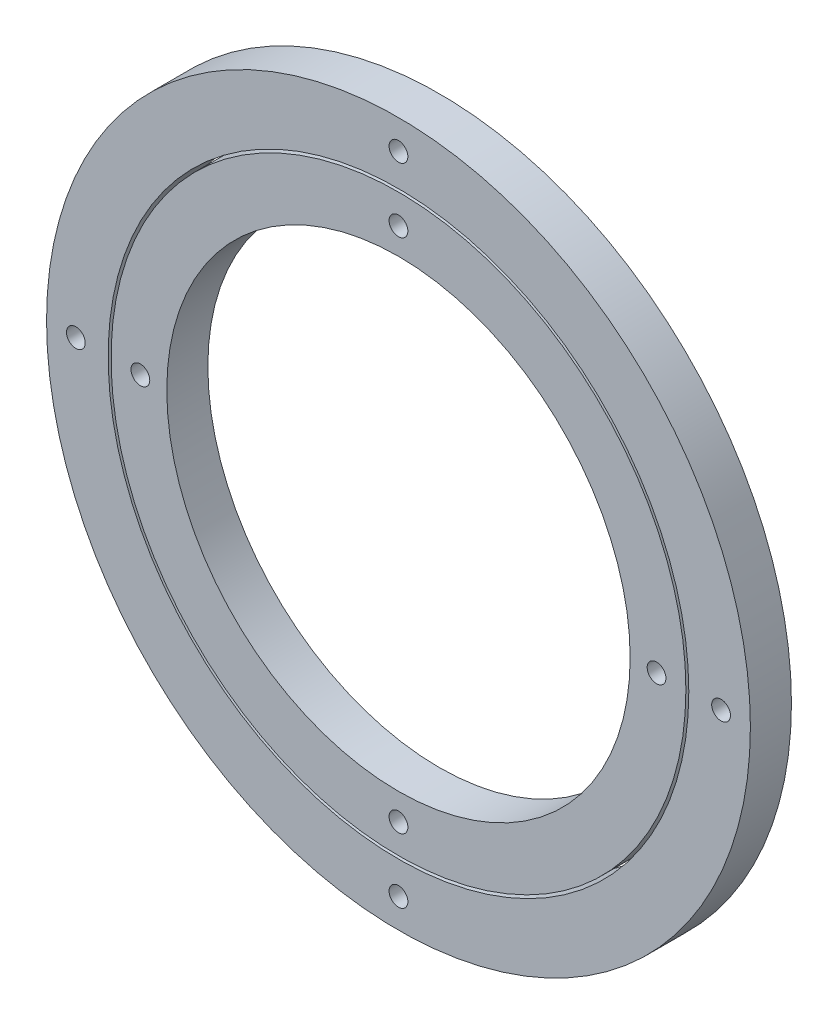
ISO-10303-21;
HEADER;
FILE_DESCRIPTION(('STEP AP214'),'2;1');
FILE_NAME('part.step','',(''),(''),'','','');
FILE_SCHEMA(('AUTOMOTIVE_DESIGN { 1 0 10303 214 1 1 1 1 }'));
ENDSEC;
DATA;
#1=APPLICATION_CONTEXT('core data for automotive mechanical design processes');
#2=APPLICATION_PROTOCOL_DEFINITION('international standard','automotive_design',2000,#1);
#3=PRODUCT_CONTEXT('',#1,'mechanical');
#4=PRODUCT('Part','Part','',(#3));
#5=PRODUCT_RELATED_PRODUCT_CATEGORY('part','',(#4));
#6=PRODUCT_DEFINITION_FORMATION('','',#4);
#7=PRODUCT_DEFINITION_CONTEXT('part definition',#1,'design');
#8=PRODUCT_DEFINITION('design','',#6,#7);
#9=PRODUCT_DEFINITION_SHAPE('','',#8);
#10=(LENGTH_UNIT() NAMED_UNIT(*) SI_UNIT(.MILLI.,.METRE.));
#11=(NAMED_UNIT(*) PLANE_ANGLE_UNIT() SI_UNIT($,.RADIAN.));
#12=(NAMED_UNIT(*) SI_UNIT($,.STERADIAN.) SOLID_ANGLE_UNIT());
#13=UNCERTAINTY_MEASURE_WITH_UNIT(LENGTH_MEASURE(1.E-05),#10,'distance_accuracy_value','');
#14=(GEOMETRIC_REPRESENTATION_CONTEXT(3) GLOBAL_UNCERTAINTY_ASSIGNED_CONTEXT((#13)) GLOBAL_UNIT_ASSIGNED_CONTEXT((#10,
#11,#12)) REPRESENTATION_CONTEXT('',''));
#15=CARTESIAN_POINT('',(0.,0.,0.));
#16=DIRECTION('',(0.,0.,1.));
#17=DIRECTION('',(1.,0.,0.));
#18=AXIS2_PLACEMENT_3D('',#15,#16,#17);
#19=CARTESIAN_POINT('',(0.,0.,7.));
#20=DIRECTION('',(0.,0.,1.));
#21=DIRECTION('',(1.,0.,0.));
#22=AXIS2_PLACEMENT_3D('',#19,#20,#21);
#23=PLANE('',#22);
#24=CARTESIAN_POINT('',(0.,0.,7.));
#25=DIRECTION('',(0.,0.,1.));
#26=DIRECTION('',(1.,0.,0.));
#27=AXIS2_PLACEMENT_3D('',#24,#25,#26);
#28=CIRCLE('',#27,49.5);
#29=CARTESIAN_POINT('',(49.5,0.,7.));
#30=VERTEX_POINT('',#29);
#31=EDGE_CURVE('E57',#30,#30,#28,.F.);
#32=ORIENTED_EDGE('',*,*,#31,.T.);
#33=EDGE_LOOP('',(#32));
#34=FACE_BOUND('',#33,.T.);
#35=CARTESIAN_POINT('',(-54.9999999999984,-1.56319401867222E-12,7.));
#36=DIRECTION('',(0.,0.,1.));
#37=DIRECTION('',(1.,0.,0.));
#38=AXIS2_PLACEMENT_3D('',#35,#36,#37);
#39=CIRCLE('',#38,1.6);
#40=CARTESIAN_POINT('',(-53.3999999999984,-1.56319401867222E-12,7.));
#41=VERTEX_POINT('',#40);
#42=EDGE_CURVE('E11',#41,#41,#39,.T.);
#43=ORIENTED_EDGE('',*,*,#42,.F.);
#44=EDGE_LOOP('',(#43));
#45=FACE_BOUND('',#44,.T.);
#46=CARTESIAN_POINT('',(55.0000000000016,1.55645846127691E-12,7.));
#47=DIRECTION('',(0.,0.,1.));
#48=DIRECTION('',(1.,0.,0.));
#49=AXIS2_PLACEMENT_3D('',#46,#47,#48);
#50=CIRCLE('',#49,1.6);
#51=CARTESIAN_POINT('',(56.6000000000016,1.55645846127691E-12,7.));
#52=VERTEX_POINT('',#51);
#53=EDGE_CURVE('E53',#52,#52,#50,.T.);
#54=ORIENTED_EDGE('',*,*,#53,.F.);
#55=EDGE_LOOP('',(#54));
#56=FACE_BOUND('',#55,.T.);
#57=CARTESIAN_POINT('',(0.,55.,7.));
#58=DIRECTION('',(0.,0.,1.));
#59=DIRECTION('',(1.,0.,0.));
#60=AXIS2_PLACEMENT_3D('',#57,#58,#59);
#61=CIRCLE('',#60,1.6);
#62=CARTESIAN_POINT('',(1.6,55.,7.));
#63=VERTEX_POINT('',#62);
#64=EDGE_CURVE('E74',#63,#63,#61,.T.);
#65=ORIENTED_EDGE('',*,*,#64,.F.);
#66=EDGE_LOOP('',(#65));
#67=FACE_BOUND('',#66,.T.);
#68=CARTESIAN_POINT('',(0.,0.,7.));
#69=DIRECTION('',(0.,0.,1.));
#70=DIRECTION('',(1.,0.,0.));
#71=AXIS2_PLACEMENT_3D('',#68,#69,#70);
#72=CIRCLE('',#71,60.);
#73=CARTESIAN_POINT('',(60.,0.,7.));
#74=VERTEX_POINT('',#73);
#75=EDGE_CURVE('E59',#74,#74,#72,.T.);
#76=ORIENTED_EDGE('',*,*,#75,.T.);
#77=EDGE_LOOP('',(#76));
#78=FACE_BOUND('',#77,.T.);
#79=CARTESIAN_POINT('',(3.11291692255382E-12,-55.,7.));
#80=DIRECTION('',(0.,0.,1.));
#81=DIRECTION('',(1.,0.,0.));
#82=AXIS2_PLACEMENT_3D('',#79,#80,#81);
#83=CIRCLE('',#82,1.6);
#84=CARTESIAN_POINT('',(1.60000000000311,-55.,7.));
#85=VERTEX_POINT('',#84);
#86=EDGE_CURVE('E48',#85,#85,#83,.T.);
#87=ORIENTED_EDGE('',*,*,#86,.F.);
#88=EDGE_LOOP('',(#87));
#89=FACE_BOUND('',#88,.T.);
#90=ADVANCED_FACE('F40',(#34,#45,#56,#67,#78,#89),#23,.T.);
#91=CARTESIAN_POINT('',(0.,0.,0.));
#92=DIRECTION('',(0.,0.,1.));
#93=DIRECTION('',(1.,0.,0.));
#94=AXIS2_PLACEMENT_3D('',#91,#92,#93);
#95=PLANE('',#94);
#96=CARTESIAN_POINT('',(0.,0.,0.));
#97=DIRECTION('',(0.,0.,1.));
#98=DIRECTION('',(1.,0.,0.));
#99=AXIS2_PLACEMENT_3D('',#96,#97,#98);
#100=CIRCLE('',#99,49.5);
#101=CARTESIAN_POINT('',(49.5,0.,0.));
#102=VERTEX_POINT('',#101);
#103=EDGE_CURVE('E44',#102,#102,#100,.T.);
#104=ORIENTED_EDGE('',*,*,#103,.T.);
#105=EDGE_LOOP('',(#104));
#106=FACE_BOUND('',#105,.T.);
#107=CARTESIAN_POINT('',(0.,0.,0.));
#108=DIRECTION('',(0.,0.,1.));
#109=DIRECTION('',(1.,0.,0.));
#110=AXIS2_PLACEMENT_3D('',#107,#108,#109);
#111=CIRCLE('',#110,60.);
#112=CARTESIAN_POINT('',(60.,0.,0.));
#113=VERTEX_POINT('',#112);
#114=EDGE_CURVE('E70',#113,#113,#111,.T.);
#115=ORIENTED_EDGE('',*,*,#114,.F.);
#116=EDGE_LOOP('',(#115));
#117=FACE_BOUND('',#116,.T.);
#118=CARTESIAN_POINT('',(0.,55.,0.));
#119=DIRECTION('',(0.,0.,1.));
#120=DIRECTION('',(1.,0.,0.));
#121=AXIS2_PLACEMENT_3D('',#118,#119,#120);
#122=CIRCLE('',#121,1.6);
#123=CARTESIAN_POINT('',(1.6,55.,0.));
#124=VERTEX_POINT('',#123);
#125=EDGE_CURVE('E67',#124,#124,#122,.T.);
#126=ORIENTED_EDGE('',*,*,#125,.T.);
#127=EDGE_LOOP('',(#126));
#128=FACE_BOUND('',#127,.T.);
#129=CARTESIAN_POINT('',(55.0000000000016,1.55645846127691E-12,0.));
#130=DIRECTION('',(0.,0.,1.));
#131=DIRECTION('',(1.,0.,0.));
#132=AXIS2_PLACEMENT_3D('',#129,#130,#131);
#133=CIRCLE('',#132,1.6);
#134=CARTESIAN_POINT('',(56.6000000000016,1.55645846127691E-12,0.));
#135=VERTEX_POINT('',#134);
#136=EDGE_CURVE('E73',#135,#135,#133,.T.);
#137=ORIENTED_EDGE('',*,*,#136,.T.);
#138=EDGE_LOOP('',(#137));
#139=FACE_BOUND('',#138,.T.);
#140=CARTESIAN_POINT('',(3.11291692255382E-12,-55.,0.));
#141=DIRECTION('',(0.,0.,1.));
#142=DIRECTION('',(1.,0.,0.));
#143=AXIS2_PLACEMENT_3D('',#140,#141,#142);
#144=CIRCLE('',#143,1.6);
#145=CARTESIAN_POINT('',(1.60000000000311,-55.,0.));
#146=VERTEX_POINT('',#145);
#147=EDGE_CURVE('E79',#146,#146,#144,.T.);
#148=ORIENTED_EDGE('',*,*,#147,.T.);
#149=EDGE_LOOP('',(#148));
#150=FACE_BOUND('',#149,.T.);
#151=CARTESIAN_POINT('',(-54.9999999999984,-1.56319401867222E-12,0.));
#152=DIRECTION('',(0.,0.,1.));
#153=DIRECTION('',(1.,0.,0.));
#154=AXIS2_PLACEMENT_3D('',#151,#152,#153);
#155=CIRCLE('',#154,1.6);
#156=CARTESIAN_POINT('',(-53.3999999999984,-1.56319401867222E-12,0.));
#157=VERTEX_POINT('',#156);
#158=EDGE_CURVE('E56',#157,#157,#155,.T.);
#159=ORIENTED_EDGE('',*,*,#158,.T.);
#160=EDGE_LOOP('',(#159));
#161=FACE_BOUND('',#160,.T.);
#162=ADVANCED_FACE('F42',(#106,#117,#128,#139,#150,#161),#95,.F.);
#163=CARTESIAN_POINT('',(0.,0.,7.));
#164=DIRECTION('',(0.,0.,-1.));
#165=DIRECTION('',(-1.,0.,0.));
#166=AXIS2_PLACEMENT_3D('',#163,#164,#165);
#167=CYLINDRICAL_SURFACE('',#166,60.);
#168=ORIENTED_EDGE('',*,*,#75,.F.);
#169=EDGE_LOOP('',(#168));
#170=FACE_BOUND('',#169,.T.);
#171=ORIENTED_EDGE('',*,*,#114,.T.);
#172=EDGE_LOOP('',(#171));
#173=FACE_BOUND('',#172,.T.);
#174=ADVANCED_FACE('F91',(#170,#173),#167,.T.);
#175=CARTESIAN_POINT('',(0.,55.,7.));
#176=DIRECTION('',(0.,0.,-1.));
#177=DIRECTION('',(-1.,0.,0.));
#178=AXIS2_PLACEMENT_3D('',#175,#176,#177);
#179=CYLINDRICAL_SURFACE('',#178,1.6);
#180=ORIENTED_EDGE('',*,*,#64,.T.);
#181=EDGE_LOOP('',(#180));
#182=FACE_BOUND('',#181,.T.);
#183=ORIENTED_EDGE('',*,*,#125,.F.);
#184=EDGE_LOOP('',(#183));
#185=FACE_BOUND('',#184,.T.);
#186=ADVANCED_FACE('F103',(#182,#185),#179,.F.);
#187=CARTESIAN_POINT('',(55.0000000000016,1.55645846127691E-12,7.));
#188=DIRECTION('',(0.,0.,-1.));
#189=DIRECTION('',(-1.,0.,0.));
#190=AXIS2_PLACEMENT_3D('',#187,#188,#189);
#191=CYLINDRICAL_SURFACE('',#190,1.6);
#192=ORIENTED_EDGE('',*,*,#53,.T.);
#193=EDGE_LOOP('',(#192));
#194=FACE_BOUND('',#193,.T.);
#195=ORIENTED_EDGE('',*,*,#136,.F.);
#196=EDGE_LOOP('',(#195));
#197=FACE_BOUND('',#196,.T.);
#198=ADVANCED_FACE('F100',(#194,#197),#191,.F.);
#199=CARTESIAN_POINT('',(3.11291692255382E-12,-55.,7.));
#200=DIRECTION('',(0.,0.,-1.));
#201=DIRECTION('',(-1.,0.,0.));
#202=AXIS2_PLACEMENT_3D('',#199,#200,#201);
#203=CYLINDRICAL_SURFACE('',#202,1.6);
#204=ORIENTED_EDGE('',*,*,#86,.T.);
#205=EDGE_LOOP('',(#204));
#206=FACE_BOUND('',#205,.T.);
#207=ORIENTED_EDGE('',*,*,#147,.F.);
#208=EDGE_LOOP('',(#207));
#209=FACE_BOUND('',#208,.T.);
#210=ADVANCED_FACE('F102',(#206,#209),#203,.F.);
#211=CARTESIAN_POINT('',(-54.9999999999984,-1.56319401867222E-12,7.));
#212=DIRECTION('',(0.,0.,-1.));
#213=DIRECTION('',(-1.,0.,0.));
#214=AXIS2_PLACEMENT_3D('',#211,#212,#213);
#215=CYLINDRICAL_SURFACE('',#214,1.6);
#216=ORIENTED_EDGE('',*,*,#42,.T.);
#217=EDGE_LOOP('',(#216));
#218=FACE_BOUND('',#217,.T.);
#219=ORIENTED_EDGE('',*,*,#158,.F.);
#220=EDGE_LOOP('',(#219));
#221=FACE_BOUND('',#220,.T.);
#222=ADVANCED_FACE('F110',(#218,#221),#215,.F.);
#223=CARTESIAN_POINT('',(0.,0.,15.));
#224=DIRECTION('',(0.,0.,-1.));
#225=DIRECTION('',(-1.,0.,0.));
#226=AXIS2_PLACEMENT_3D('',#223,#224,#225);
#227=CYLINDRICAL_SURFACE('',#226,49.5);
#228=ORIENTED_EDGE('',*,*,#31,.F.);
#229=EDGE_LOOP('',(#228));
#230=FACE_BOUND('',#229,.T.);
#231=ORIENTED_EDGE('',*,*,#103,.F.);
#232=EDGE_LOOP('',(#231));
#233=FACE_BOUND('',#232,.T.);
#234=ADVANCED_FACE('F120',(#230,#233),#227,.F.);
#235=CLOSED_SHELL('',(#90,#162,#174,#186,#198,#210,#222,#234));
#236=MANIFOLD_SOLID_BREP('B2',#235);
#237=CARTESIAN_POINT('',(0.,0.,7.));
#238=DIRECTION('',(0.,0.,-1.));
#239=DIRECTION('',(-1.,0.,0.));
#240=AXIS2_PLACEMENT_3D('',#237,#238,#239);
#241=CYLINDRICAL_SURFACE('',#240,39.5);
#242=CARTESIAN_POINT('',(0.,0.,7.));
#243=DIRECTION('',(0.,0.,1.));
#244=DIRECTION('',(1.,0.,0.));
#245=AXIS2_PLACEMENT_3D('',#242,#243,#244);
#246=CIRCLE('',#245,39.5);
#247=CARTESIAN_POINT('',(39.5,0.,7.));
#248=VERTEX_POINT('',#247);
#249=EDGE_CURVE('E39',#248,#248,#246,.T.);
#250=ORIENTED_EDGE('',*,*,#249,.T.);
#251=EDGE_LOOP('',(#250));
#252=FACE_BOUND('',#251,.T.);
#253=CARTESIAN_POINT('',(0.,0.,0.));
#254=DIRECTION('',(0.,0.,1.));
#255=DIRECTION('',(1.,0.,0.));
#256=AXIS2_PLACEMENT_3D('',#253,#254,#255);
#257=CIRCLE('',#256,39.5);
#258=CARTESIAN_POINT('',(39.5,0.,0.));
#259=VERTEX_POINT('',#258);
#260=EDGE_CURVE('E189',#259,#259,#257,.T.);
#261=ORIENTED_EDGE('',*,*,#260,.F.);
#262=EDGE_LOOP('',(#261));
#263=FACE_BOUND('',#262,.T.);
#264=ADVANCED_FACE('F185',(#252,#263),#241,.F.);
#265=CARTESIAN_POINT('',(0.,44.,7.));
#266=DIRECTION('',(0.,0.,-1.));
#267=DIRECTION('',(-1.,0.,0.));
#268=AXIS2_PLACEMENT_3D('',#265,#266,#267);
#269=CYLINDRICAL_SURFACE('',#268,1.6);
#270=CARTESIAN_POINT('',(0.,44.,7.));
#271=DIRECTION('',(0.,0.,1.));
#272=DIRECTION('',(1.,0.,0.));
#273=AXIS2_PLACEMENT_3D('',#270,#271,#272);
#274=CIRCLE('',#273,1.6);
#275=CARTESIAN_POINT('',(1.6,44.,7.));
#276=VERTEX_POINT('',#275);
#277=EDGE_CURVE('E196',#276,#276,#274,.T.);
#278=ORIENTED_EDGE('',*,*,#277,.T.);
#279=EDGE_LOOP('',(#278));
#280=FACE_BOUND('',#279,.T.);
#281=CARTESIAN_POINT('',(0.,44.,0.));
#282=DIRECTION('',(0.,0.,1.));
#283=DIRECTION('',(1.,0.,0.));
#284=AXIS2_PLACEMENT_3D('',#281,#282,#283);
#285=CIRCLE('',#284,1.6);
#286=CARTESIAN_POINT('',(1.6,44.,0.));
#287=VERTEX_POINT('',#286);
#288=EDGE_CURVE('E198',#287,#287,#285,.T.);
#289=ORIENTED_EDGE('',*,*,#288,.F.);
#290=EDGE_LOOP('',(#289));
#291=FACE_BOUND('',#290,.T.);
#292=ADVANCED_FACE('F244',(#280,#291),#269,.F.);
#293=CARTESIAN_POINT('',(44.0000000000012,1.24516676902153E-12,7.));
#294=DIRECTION('',(0.,0.,-1.));
#295=DIRECTION('',(-1.,0.,0.));
#296=AXIS2_PLACEMENT_3D('',#293,#294,#295);
#297=CYLINDRICAL_SURFACE('',#296,1.6);
#298=CARTESIAN_POINT('',(44.0000000000012,1.24516676902153E-12,7.));
#299=DIRECTION('',(0.,0.,1.));
#300=DIRECTION('',(1.,0.,0.));
#301=AXIS2_PLACEMENT_3D('',#298,#299,#300);
#302=CIRCLE('',#301,1.6);
#303=CARTESIAN_POINT('',(45.6000000000012,1.24516676902153E-12,7.));
#304=VERTEX_POINT('',#303);
#305=EDGE_CURVE('E201',#304,#304,#302,.T.);
#306=ORIENTED_EDGE('',*,*,#305,.T.);
#307=EDGE_LOOP('',(#306));
#308=FACE_BOUND('',#307,.T.);
#309=CARTESIAN_POINT('',(44.0000000000012,1.24516676902153E-12,0.));
#310=DIRECTION('',(0.,0.,1.));
#311=DIRECTION('',(1.,0.,0.));
#312=AXIS2_PLACEMENT_3D('',#309,#310,#311);
#313=CIRCLE('',#312,1.6);
#314=CARTESIAN_POINT('',(45.6000000000012,1.24516676902153E-12,0.));
#315=VERTEX_POINT('',#314);
#316=EDGE_CURVE('E204',#315,#315,#313,.T.);
#317=ORIENTED_EDGE('',*,*,#316,.F.);
#318=EDGE_LOOP('',(#317));
#319=FACE_BOUND('',#318,.T.);
#320=ADVANCED_FACE('F249',(#308,#319),#297,.F.);
#321=CARTESIAN_POINT('',(2.49033353804306E-12,-44.,7.));
#322=DIRECTION('',(0.,0.,-1.));
#323=DIRECTION('',(-1.,0.,0.));
#324=AXIS2_PLACEMENT_3D('',#321,#322,#323);
#325=CYLINDRICAL_SURFACE('',#324,1.6);
#326=CARTESIAN_POINT('',(2.49033353804306E-12,-44.,7.));
#327=DIRECTION('',(0.,0.,1.));
#328=DIRECTION('',(1.,0.,0.));
#329=AXIS2_PLACEMENT_3D('',#326,#327,#328);
#330=CIRCLE('',#329,1.6);
#331=CARTESIAN_POINT('',(1.60000000000249,-44.,7.));
#332=VERTEX_POINT('',#331);
#333=EDGE_CURVE('E207',#332,#332,#330,.T.);
#334=ORIENTED_EDGE('',*,*,#333,.T.);
#335=EDGE_LOOP('',(#334));
#336=FACE_BOUND('',#335,.T.);
#337=CARTESIAN_POINT('',(2.49033353804306E-12,-44.,0.));
#338=DIRECTION('',(0.,0.,1.));
#339=DIRECTION('',(1.,0.,0.));
#340=AXIS2_PLACEMENT_3D('',#337,#338,#339);
#341=CIRCLE('',#340,1.6);
#342=CARTESIAN_POINT('',(1.60000000000249,-44.,0.));
#343=VERTEX_POINT('',#342);
#344=EDGE_CURVE('E210',#343,#343,#341,.T.);
#345=ORIENTED_EDGE('',*,*,#344,.F.);
#346=EDGE_LOOP('',(#345));
#347=FACE_BOUND('',#346,.T.);
#348=ADVANCED_FACE('F255',(#336,#347),#325,.F.);
#349=CARTESIAN_POINT('',(0.,0.,7.));
#350=DIRECTION('',(0.,0.,1.));
#351=DIRECTION('',(1.,0.,0.));
#352=AXIS2_PLACEMENT_3D('',#349,#350,#351);
#353=PLANE('',#352);
#354=CARTESIAN_POINT('',(-43.9999999999988,-1.25055521493778E-12,7.));
#355=DIRECTION('',(0.,0.,1.));
#356=DIRECTION('',(1.,0.,0.));
#357=AXIS2_PLACEMENT_3D('',#354,#355,#356);
#358=CIRCLE('',#357,1.6);
#359=CARTESIAN_POINT('',(-42.3999999999988,-1.25055521493778E-12,7.));
#360=VERTEX_POINT('',#359);
#361=EDGE_CURVE('E213',#360,#360,#358,.T.);
#362=ORIENTED_EDGE('',*,*,#361,.F.);
#363=EDGE_LOOP('',(#362));
#364=FACE_BOUND('',#363,.T.);
#365=ORIENTED_EDGE('',*,*,#305,.F.);
#366=EDGE_LOOP('',(#365));
#367=FACE_BOUND('',#366,.T.);
#368=ORIENTED_EDGE('',*,*,#277,.F.);
#369=EDGE_LOOP('',(#368));
#370=FACE_BOUND('',#369,.T.);
#371=ORIENTED_EDGE('',*,*,#249,.F.);
#372=EDGE_LOOP('',(#371));
#373=FACE_BOUND('',#372,.T.);
#374=ORIENTED_EDGE('',*,*,#333,.F.);
#375=EDGE_LOOP('',(#374));
#376=FACE_BOUND('',#375,.T.);
#377=CARTESIAN_POINT('',(0.,0.,7.));
#378=DIRECTION('',(0.,0.,1.));
#379=DIRECTION('',(1.,0.,0.));
#380=AXIS2_PLACEMENT_3D('',#377,#378,#379);
#381=CIRCLE('',#380,49.);
#382=CARTESIAN_POINT('',(49.,0.,7.));
#383=VERTEX_POINT('',#382);
#384=EDGE_CURVE('E219',#383,#383,#381,.F.);
#385=ORIENTED_EDGE('',*,*,#384,.F.);
#386=EDGE_LOOP('',(#385));
#387=FACE_BOUND('',#386,.T.);
#388=ADVANCED_FACE('F239',(#364,#367,#370,#373,#376,#387),#353,.T.);
#389=CARTESIAN_POINT('',(-43.9999999999988,-1.25055521493778E-12,7.));
#390=DIRECTION('',(0.,0.,-1.));
#391=DIRECTION('',(-1.,0.,0.));
#392=AXIS2_PLACEMENT_3D('',#389,#390,#391);
#393=CYLINDRICAL_SURFACE('',#392,1.6);
#394=ORIENTED_EDGE('',*,*,#361,.T.);
#395=EDGE_LOOP('',(#394));
#396=FACE_BOUND('',#395,.T.);
#397=CARTESIAN_POINT('',(-43.9999999999988,-1.25055521493778E-12,0.));
#398=DIRECTION('',(0.,0.,1.));
#399=DIRECTION('',(1.,0.,0.));
#400=AXIS2_PLACEMENT_3D('',#397,#398,#399);
#401=CIRCLE('',#400,1.6);
#402=CARTESIAN_POINT('',(-42.3999999999988,-1.25055521493778E-12,0.));
#403=VERTEX_POINT('',#402);
#404=EDGE_CURVE('E216',#403,#403,#401,.T.);
#405=ORIENTED_EDGE('',*,*,#404,.F.);
#406=EDGE_LOOP('',(#405));
#407=FACE_BOUND('',#406,.T.);
#408=ADVANCED_FACE('F231',(#396,#407),#393,.F.);
#409=CARTESIAN_POINT('',(0.,0.,0.));
#410=DIRECTION('',(0.,0.,1.));
#411=DIRECTION('',(1.,0.,0.));
#412=AXIS2_PLACEMENT_3D('',#409,#410,#411);
#413=PLANE('',#412);
#414=ORIENTED_EDGE('',*,*,#404,.T.);
#415=EDGE_LOOP('',(#414));
#416=FACE_BOUND('',#415,.T.);
#417=ORIENTED_EDGE('',*,*,#344,.T.);
#418=EDGE_LOOP('',(#417));
#419=FACE_BOUND('',#418,.T.);
#420=ORIENTED_EDGE('',*,*,#316,.T.);
#421=EDGE_LOOP('',(#420));
#422=FACE_BOUND('',#421,.T.);
#423=ORIENTED_EDGE('',*,*,#288,.T.);
#424=EDGE_LOOP('',(#423));
#425=FACE_BOUND('',#424,.T.);
#426=ORIENTED_EDGE('',*,*,#260,.T.);
#427=EDGE_LOOP('',(#426));
#428=FACE_BOUND('',#427,.T.);
#429=CARTESIAN_POINT('',(0.,0.,0.));
#430=DIRECTION('',(0.,0.,1.));
#431=DIRECTION('',(1.,0.,0.));
#432=AXIS2_PLACEMENT_3D('',#429,#430,#431);
#433=CIRCLE('',#432,49.);
#434=CARTESIAN_POINT('',(49.,0.,0.));
#435=VERTEX_POINT('',#434);
#436=EDGE_CURVE('E224',#435,#435,#433,.T.);
#437=ORIENTED_EDGE('',*,*,#436,.F.);
#438=EDGE_LOOP('',(#437));
#439=FACE_BOUND('',#438,.T.);
#440=ADVANCED_FACE('F187',(#416,#419,#422,#425,#428,#439),#413,.F.);
#441=CARTESIAN_POINT('',(0.,0.,15.));
#442=DIRECTION('',(0.,0.,-1.));
#443=DIRECTION('',(-1.,0.,0.));
#444=AXIS2_PLACEMENT_3D('',#441,#442,#443);
#445=CYLINDRICAL_SURFACE('',#444,49.);
#446=ORIENTED_EDGE('',*,*,#384,.T.);
#447=EDGE_LOOP('',(#446));
#448=FACE_BOUND('',#447,.T.);
#449=ORIENTED_EDGE('',*,*,#436,.T.);
#450=EDGE_LOOP('',(#449));
#451=FACE_BOUND('',#450,.T.);
#452=ADVANCED_FACE('F228',(#448,#451),#445,.T.);
#453=CLOSED_SHELL('',(#264,#292,#320,#348,#388,#408,#440,#452));
#454=MANIFOLD_SOLID_BREP('B6',#453);
#455=ADVANCED_BREP_SHAPE_REPRESENTATION('',(#18,#236,#454),#14);
#456=SHAPE_DEFINITION_REPRESENTATION(#9,#455);
ENDSEC;
END-ISO-10303-21;
